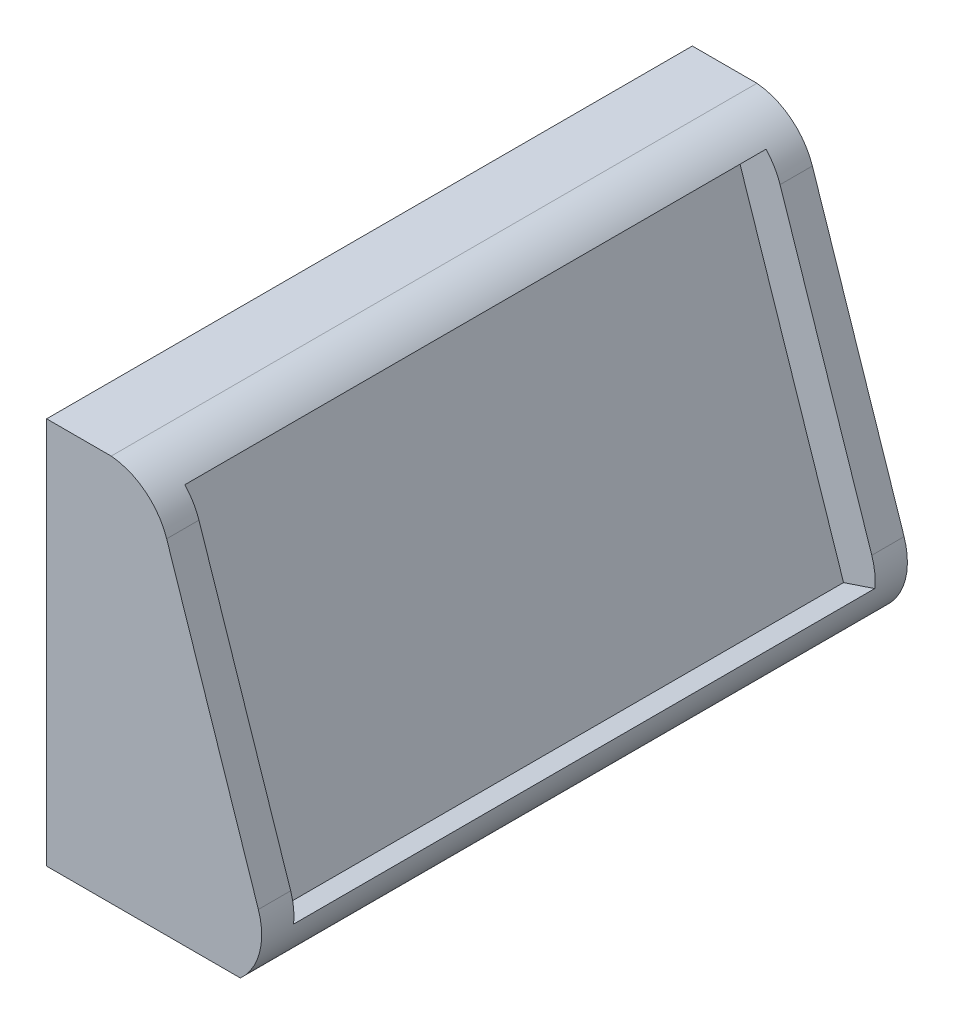
ISO-10303-21;
HEADER;
FILE_DESCRIPTION(('STEP AP214'),'2;1');
FILE_NAME('part.step','',(''),(''),'','','');
FILE_SCHEMA(('AUTOMOTIVE_DESIGN { 1 0 10303 214 1 1 1 1 }'));
ENDSEC;
DATA;
#1=APPLICATION_CONTEXT('core data for automotive mechanical design processes');
#2=APPLICATION_PROTOCOL_DEFINITION('international standard','automotive_design',2000,#1);
#3=PRODUCT_CONTEXT('',#1,'mechanical');
#4=PRODUCT('Part','Part','',(#3));
#5=PRODUCT_RELATED_PRODUCT_CATEGORY('part','',(#4));
#6=PRODUCT_DEFINITION_FORMATION('','',#4);
#7=PRODUCT_DEFINITION_CONTEXT('part definition',#1,'design');
#8=PRODUCT_DEFINITION('design','',#6,#7);
#9=PRODUCT_DEFINITION_SHAPE('','',#8);
#10=(LENGTH_UNIT() NAMED_UNIT(*) SI_UNIT(.MILLI.,.METRE.));
#11=(NAMED_UNIT(*) PLANE_ANGLE_UNIT() SI_UNIT($,.RADIAN.));
#12=(NAMED_UNIT(*) SI_UNIT($,.STERADIAN.) SOLID_ANGLE_UNIT());
#13=UNCERTAINTY_MEASURE_WITH_UNIT(LENGTH_MEASURE(1.E-05),#10,'distance_accuracy_value','');
#14=(GEOMETRIC_REPRESENTATION_CONTEXT(3) GLOBAL_UNCERTAINTY_ASSIGNED_CONTEXT((#13)) GLOBAL_UNIT_ASSIGNED_CONTEXT((#10,
#11,#12)) REPRESENTATION_CONTEXT('',''));
#15=CARTESIAN_POINT('',(0.,0.,0.));
#16=DIRECTION('',(0.,0.,1.));
#17=DIRECTION('',(1.,0.,0.));
#18=AXIS2_PLACEMENT_3D('',#15,#16,#17);
#19=CARTESIAN_POINT('',(23.6920997883031,7.89736659610103,0.));
#20=DIRECTION('',(0.948683298050514,0.316227766016838,0.));
#21=DIRECTION('',(-0.316227766016838,0.948683298050514,0.));
#22=AXIS2_PLACEMENT_3D('',#19,#20,#21);
#23=PLANE('',#22);
#24=DIRECTION('',(0.316227766016838,-0.948683298050514,0.));
#25=VECTOR('',#24,1.);
#26=CARTESIAN_POINT('',(15.6920997883031,31.897366596101,50.));
#27=LINE('',#26,#25);
#28=CARTESIAN_POINT('',(18.590375137541,23.2025405483874,50.));
#29=VERTEX_POINT('',#28);
#30=CARTESIAN_POINT('',(32.7938244390652,-19.4078073561853,50.));
#31=VERTEX_POINT('',#30);
#32=EDGE_CURVE('E158',#29,#31,#27,.T.);
#33=ORIENTED_EDGE('',*,*,#32,.T.);
#34=DIRECTION('',(0.,0.,1.));
#35=VECTOR('',#34,1.);
#36=CARTESIAN_POINT('',(32.7938244390652,-19.4078073561853,-50.));
#37=LINE('',#36,#35);
#38=CARTESIAN_POINT('',(32.7938244390652,-19.4078073561853,45.));
#39=VERTEX_POINT('',#38);
#40=EDGE_CURVE('E207',#31,#39,#37,.F.);
#41=ORIENTED_EDGE('',*,*,#40,.T.);
#42=DIRECTION('',(0.316227766016838,-0.948683298050514,0.));
#43=VECTOR('',#42,1.);
#44=CARTESIAN_POINT('',(17.2732386183873,27.1539501058485,45.));
#45=LINE('',#44,#43);
#46=CARTESIAN_POINT('',(18.590375137541,23.2025405483874,45.));
#47=VERTEX_POINT('',#46);
#48=EDGE_CURVE('E148',#47,#39,#45,.T.);
#49=ORIENTED_EDGE('',*,*,#48,.F.);
#50=DIRECTION('',(0.,0.,1.));
#51=VECTOR('',#50,1.);
#52=CARTESIAN_POINT('',(18.590375137541,23.2025405483874,50.));
#53=LINE('',#52,#51);
#54=EDGE_CURVE('E190',#47,#29,#53,.T.);
#55=ORIENTED_EDGE('',*,*,#54,.T.);
#56=EDGE_LOOP('',(#33,#41,#49,#55));
#57=FACE_BOUND('',#56,.T.);
#58=ADVANCED_FACE('F36',(#57),#23,.T.);
#59=CARTESIAN_POINT('',(10.,-30.,-50.));
#60=DIRECTION('',(0.,0.,1.));
#61=DIRECTION('',(1.,0.,0.));
#62=AXIS2_PLACEMENT_3D('',#59,#60,#61);
#63=PLANE('',#62);
#64=DIRECTION('',(-0.316227766016838,0.948683298050514,0.));
#65=VECTOR('',#64,1.);
#66=CARTESIAN_POINT('',(15.6920997883031,31.897366596101,-50.));
#67=LINE('',#66,#65);
#68=CARTESIAN_POINT('',(32.7938244390652,-19.4078073561853,-50.));
#69=VERTEX_POINT('',#68);
#70=CARTESIAN_POINT('',(18.590375137541,23.2025405483874,-50.));
#71=VERTEX_POINT('',#70);
#72=EDGE_CURVE('E161',#69,#71,#67,.T.);
#73=ORIENTED_EDGE('',*,*,#72,.F.);
#74=CARTESIAN_POINT('',(23.3069914585601,-22.5700850163537,-50.));
#75=DIRECTION('',(0.,0.,1.));
#76=DIRECTION('',(1.,0.,0.));
#77=AXIS2_PLACEMENT_3D('',#74,#75,#76);
#78=CIRCLE('',#77,10.);
#79=CARTESIAN_POINT('',(30.,-30.,-50.));
#80=VERTEX_POINT('',#79);
#81=EDGE_CURVE('E44',#69,#80,#78,.F.);
#82=ORIENTED_EDGE('',*,*,#81,.T.);
#83=DIRECTION('',(-1.,0.,0.));
#84=VECTOR('',#83,1.);
#85=CARTESIAN_POINT('',(10.,-30.,-50.));
#86=LINE('',#85,#84);
#87=CARTESIAN_POINT('',(0.,-30.,-50.));
#88=VERTEX_POINT('',#87);
#89=EDGE_CURVE('E170',#80,#88,#86,.T.);
#90=ORIENTED_EDGE('',*,*,#89,.T.);
#91=DIRECTION('',(0.,1.,0.));
#92=VECTOR('',#91,1.);
#93=CARTESIAN_POINT('',(0.,-30.,-50.));
#94=LINE('',#93,#92);
#95=CARTESIAN_POINT('',(0.,30.,-50.));
#96=VERTEX_POINT('',#95);
#97=EDGE_CURVE('E166',#88,#96,#94,.T.);
#98=ORIENTED_EDGE('',*,*,#97,.T.);
#99=DIRECTION('',(-1.,0.,0.));
#100=VECTOR('',#99,1.);
#101=CARTESIAN_POINT('',(10.,30.,-50.));
#102=LINE('',#101,#100);
#103=CARTESIAN_POINT('',(10.,30.,-50.));
#104=VERTEX_POINT('',#103);
#105=EDGE_CURVE('E187',#104,#96,#102,.T.);
#106=ORIENTED_EDGE('',*,*,#105,.F.);
#107=CARTESIAN_POINT('',(9.10354215703585,20.040262888219,-50.));
#108=DIRECTION('',(0.,0.,1.));
#109=DIRECTION('',(1.,0.,0.));
#110=AXIS2_PLACEMENT_3D('',#107,#108,#109);
#111=CIRCLE('',#110,10.);
#112=EDGE_CURVE('E202',#104,#71,#111,.F.);
#113=ORIENTED_EDGE('',*,*,#112,.T.);
#114=EDGE_LOOP('',(#73,#82,#90,#98,#106,#113));
#115=FACE_BOUND('',#114,.T.);
#116=ADVANCED_FACE('F217',(#115),#63,.F.);
#117=CARTESIAN_POINT('',(10.,30.,50.));
#118=DIRECTION('',(0.,-1.,0.));
#119=DIRECTION('',(0.,0.,-1.));
#120=AXIS2_PLACEMENT_3D('',#117,#118,#119);
#121=PLANE('',#120);
#122=DIRECTION('',(0.,0.,1.));
#123=VECTOR('',#122,1.);
#124=CARTESIAN_POINT('',(0.,30.,50.));
#125=LINE('',#124,#123);
#126=CARTESIAN_POINT('',(0.,30.,50.));
#127=VERTEX_POINT('',#126);
#128=EDGE_CURVE('E174',#96,#127,#125,.T.);
#129=ORIENTED_EDGE('',*,*,#128,.T.);
#130=DIRECTION('',(-1.,0.,0.));
#131=VECTOR('',#130,1.);
#132=CARTESIAN_POINT('',(10.,30.,50.));
#133=LINE('',#132,#131);
#134=CARTESIAN_POINT('',(10.,30.,50.));
#135=VERTEX_POINT('',#134);
#136=EDGE_CURVE('E184',#135,#127,#133,.T.);
#137=ORIENTED_EDGE('',*,*,#136,.F.);
#138=DIRECTION('',(0.,0.,1.));
#139=VECTOR('',#138,1.);
#140=CARTESIAN_POINT('',(10.,30.,50.));
#141=LINE('',#140,#139);
#142=EDGE_CURVE('E167',#104,#135,#141,.T.);
#143=ORIENTED_EDGE('',*,*,#142,.F.);
#144=ORIENTED_EDGE('',*,*,#105,.T.);
#145=EDGE_LOOP('',(#129,#137,#143,#144));
#146=FACE_BOUND('',#145,.T.);
#147=ADVANCED_FACE('F241',(#146),#121,.F.);
#148=CARTESIAN_POINT('',(10.,-30.,50.));
#149=DIRECTION('',(0.,0.,-1.));
#150=DIRECTION('',(-1.,0.,0.));
#151=AXIS2_PLACEMENT_3D('',#148,#149,#150);
#152=PLANE('',#151);
#153=DIRECTION('',(-1.,0.,0.));
#154=VECTOR('',#153,1.);
#155=CARTESIAN_POINT('',(10.,-30.,50.));
#156=LINE('',#155,#154);
#157=CARTESIAN_POINT('',(30.,-30.,50.));
#158=VERTEX_POINT('',#157);
#159=CARTESIAN_POINT('',(0.,-30.,50.));
#160=VERTEX_POINT('',#159);
#161=EDGE_CURVE('E181',#158,#160,#156,.T.);
#162=ORIENTED_EDGE('',*,*,#161,.F.);
#163=CARTESIAN_POINT('',(23.3069914585601,-22.5700850163537,50.));
#164=DIRECTION('',(0.,0.,-1.));
#165=DIRECTION('',(-1.,0.,0.));
#166=AXIS2_PLACEMENT_3D('',#163,#164,#165);
#167=CIRCLE('',#166,10.);
#168=EDGE_CURVE('E11',#158,#31,#167,.F.);
#169=ORIENTED_EDGE('',*,*,#168,.T.);
#170=ORIENTED_EDGE('',*,*,#32,.F.);
#171=CARTESIAN_POINT('',(9.10354215703585,20.040262888219,50.));
#172=DIRECTION('',(0.,0.,-1.));
#173=DIRECTION('',(-1.,0.,0.));
#174=AXIS2_PLACEMENT_3D('',#171,#172,#173);
#175=CIRCLE('',#174,10.);
#176=EDGE_CURVE('E200',#29,#135,#175,.F.);
#177=ORIENTED_EDGE('',*,*,#176,.T.);
#178=ORIENTED_EDGE('',*,*,#136,.T.);
#179=DIRECTION('',(0.,-1.,0.));
#180=VECTOR('',#179,1.);
#181=CARTESIAN_POINT('',(0.,-30.,50.));
#182=LINE('',#181,#180);
#183=EDGE_CURVE('E176',#127,#160,#182,.T.);
#184=ORIENTED_EDGE('',*,*,#183,.T.);
#185=EDGE_LOOP('',(#162,#169,#170,#177,#178,#184));
#186=FACE_BOUND('',#185,.T.);
#187=ADVANCED_FACE('F229',(#186),#152,.F.);
#188=CARTESIAN_POINT('',(10.,-30.,50.));
#189=DIRECTION('',(0.,1.,0.));
#190=DIRECTION('',(0.,0.,1.));
#191=AXIS2_PLACEMENT_3D('',#188,#189,#190);
#192=PLANE('',#191);
#193=DIRECTION('',(0.,0.,-1.));
#194=VECTOR('',#193,1.);
#195=CARTESIAN_POINT('',(0.,-30.,50.));
#196=LINE('',#195,#194);
#197=EDGE_CURVE('E171',#160,#88,#196,.T.);
#198=ORIENTED_EDGE('',*,*,#197,.T.);
#199=ORIENTED_EDGE('',*,*,#89,.F.);
#200=DIRECTION('',(0.,0.,1.));
#201=VECTOR('',#200,1.);
#202=CARTESIAN_POINT('',(30.,-30.,-113.245553203368));
#203=LINE('',#202,#201);
#204=EDGE_CURVE('E163',#80,#158,#203,.T.);
#205=ORIENTED_EDGE('',*,*,#204,.T.);
#206=ORIENTED_EDGE('',*,*,#161,.T.);
#207=EDGE_LOOP('',(#198,#199,#205,#206));
#208=FACE_BOUND('',#207,.T.);
#209=ADVANCED_FACE('F223',(#208),#192,.F.);
#210=CARTESIAN_POINT('',(0.,0.,0.));
#211=DIRECTION('',(-1.,0.,0.));
#212=DIRECTION('',(0.,0.,1.));
#213=AXIS2_PLACEMENT_3D('',#210,#211,#212);
#214=PLANE('',#213);
#215=ORIENTED_EDGE('',*,*,#97,.F.);
#216=ORIENTED_EDGE('',*,*,#197,.F.);
#217=ORIENTED_EDGE('',*,*,#183,.F.);
#218=ORIENTED_EDGE('',*,*,#128,.F.);
#219=EDGE_LOOP('',(#215,#216,#217,#218));
#220=FACE_BOUND('',#219,.T.);
#221=ADVANCED_FACE('F244',(#220),#214,.T.);
#222=DIRECTION('',(-0.316227766016838,0.948683298050514,0.));
#223=VECTOR('',#222,1.);
#224=CARTESIAN_POINT('',(17.2732386183873,27.1539501058485,-45.));
#225=LINE('',#224,#223);
#226=CARTESIAN_POINT('',(32.7938244390652,-19.4078073561853,-45.));
#227=VERTEX_POINT('',#226);
#228=CARTESIAN_POINT('',(18.590375137541,23.2025405483874,-45.));
#229=VERTEX_POINT('',#228);
#230=EDGE_CURVE('E150',#227,#229,#225,.T.);
#231=ORIENTED_EDGE('',*,*,#230,.F.);
#232=DIRECTION('',(0.,0.,1.));
#233=VECTOR('',#232,1.);
#234=CARTESIAN_POINT('',(32.7938244390652,-19.4078073561853,-50.));
#235=LINE('',#234,#233);
#236=EDGE_CURVE('E205',#227,#69,#235,.F.);
#237=ORIENTED_EDGE('',*,*,#236,.T.);
#238=ORIENTED_EDGE('',*,*,#72,.T.);
#239=DIRECTION('',(0.,0.,1.));
#240=VECTOR('',#239,1.);
#241=CARTESIAN_POINT('',(18.590375137541,23.2025405483874,50.));
#242=LINE('',#241,#240);
#243=EDGE_CURVE('E192',#71,#229,#242,.T.);
#244=ORIENTED_EDGE('',*,*,#243,.T.);
#245=EDGE_LOOP('',(#231,#237,#238,#244));
#246=FACE_BOUND('',#245,.T.);
#247=ADVANCED_FACE('F248',(#246),#23,.T.);
#248=CARTESIAN_POINT('',(17.2732386183873,27.1539501058485,45.));
#249=DIRECTION('',(0.,0.,-1.));
#250=DIRECTION('',(0.,1.,0.));
#251=AXIS2_PLACEMENT_3D('',#248,#249,#250);
#252=PLANE('',#251);
#253=ORIENTED_EDGE('',*,*,#48,.T.);
#254=CARTESIAN_POINT('',(23.3069914585601,-22.5700850163537,45.));
#255=DIRECTION('',(0.,0.,-1.));
#256=DIRECTION('',(0.,1.,0.));
#257=AXIS2_PLACEMENT_3D('',#254,#255,#256);
#258=CIRCLE('',#257,10.);
#259=CARTESIAN_POINT('',(33.2488808732584,-23.6465769419666,45.));
#260=VERTEX_POINT('',#259);
#261=EDGE_CURVE('E59',#39,#260,#258,.T.);
#262=ORIENTED_EDGE('',*,*,#261,.T.);
#263=DIRECTION('',(-0.948683298050514,-0.316227766016838,0.));
#264=VECTOR('',#263,1.);
#265=CARTESIAN_POINT('',(34.1109609582189,-23.3592169136464,45.));
#266=LINE('',#265,#264);
#267=CARTESIAN_POINT('',(28.4188611699158,-25.2565835097474,45.));
#268=VERTEX_POINT('',#267);
#269=EDGE_CURVE('E156',#260,#268,#266,.T.);
#270=ORIENTED_EDGE('',*,*,#269,.T.);
#271=DIRECTION('',(0.316227766016838,-0.948683298050514,0.));
#272=VECTOR('',#271,1.);
#273=CARTESIAN_POINT('',(11.5811388300842,25.2565835097474,45.));
#274=LINE('',#273,#272);
#275=CARTESIAN_POINT('',(11.5811388300842,25.2565835097474,45.));
#276=VERTEX_POINT('',#275);
#277=EDGE_CURVE('E251',#276,#268,#274,.T.);
#278=ORIENTED_EDGE('',*,*,#277,.F.);
#279=DIRECTION('',(-0.948683298050514,-0.316227766016838,0.));
#280=VECTOR('',#279,1.);
#281=CARTESIAN_POINT('',(17.2732386183873,27.1539501058485,45.));
#282=LINE('',#281,#280);
#283=CARTESIAN_POINT('',(16.4111585334267,26.8665900775283,45.));
#284=VERTEX_POINT('',#283);
#285=EDGE_CURVE('E134',#284,#276,#282,.T.);
#286=ORIENTED_EDGE('',*,*,#285,.F.);
#287=CARTESIAN_POINT('',(9.10354215703585,20.040262888219,45.));
#288=DIRECTION('',(0.,0.,-1.));
#289=DIRECTION('',(0.,1.,0.));
#290=AXIS2_PLACEMENT_3D('',#287,#288,#289);
#291=CIRCLE('',#290,10.);
#292=EDGE_CURVE('E198',#284,#47,#291,.T.);
#293=ORIENTED_EDGE('',*,*,#292,.T.);
#294=EDGE_LOOP('',(#253,#262,#270,#278,#286,#293));
#295=FACE_BOUND('',#294,.T.);
#296=ADVANCED_FACE('F254',(#295),#252,.T.);
#297=CARTESIAN_POINT('',(34.1109609582189,-23.3592169136464,45.));
#298=DIRECTION('',(-0.316227766016838,0.948683298050514,0.));
#299=DIRECTION('',(-0.948683298050514,-0.316227766016838,0.));
#300=AXIS2_PLACEMENT_3D('',#297,#298,#299);
#301=PLANE('',#300);
#302=ORIENTED_EDGE('',*,*,#269,.F.);
#303=DIRECTION('',(0.,0.,-1.));
#304=VECTOR('',#303,1.);
#305=CARTESIAN_POINT('',(33.2488808732584,-23.6465769419666,45.));
#306=LINE('',#305,#304);
#307=CARTESIAN_POINT('',(33.2488808732584,-23.6465769419666,-45.));
#308=VERTEX_POINT('',#307);
#309=EDGE_CURVE('E51',#260,#308,#306,.T.);
#310=ORIENTED_EDGE('',*,*,#309,.T.);
#311=DIRECTION('',(-0.948683298050514,-0.316227766016838,0.));
#312=VECTOR('',#311,1.);
#313=CARTESIAN_POINT('',(34.1109609582189,-23.3592169136464,-45.));
#314=LINE('',#313,#312);
#315=CARTESIAN_POINT('',(28.4188611699158,-25.2565835097475,-45.));
#316=VERTEX_POINT('',#315);
#317=EDGE_CURVE('E133',#308,#316,#314,.T.);
#318=ORIENTED_EDGE('',*,*,#317,.T.);
#319=DIRECTION('',(0.,0.,-1.));
#320=VECTOR('',#319,1.);
#321=CARTESIAN_POINT('',(28.4188611699158,-25.2565835097474,45.));
#322=LINE('',#321,#320);
#323=EDGE_CURVE('E144',#268,#316,#322,.T.);
#324=ORIENTED_EDGE('',*,*,#323,.F.);
#325=EDGE_LOOP('',(#302,#310,#318,#324));
#326=FACE_BOUND('',#325,.T.);
#327=ADVANCED_FACE('F250',(#326),#301,.T.);
#328=CARTESIAN_POINT('',(17.2732386183873,27.1539501058485,-45.));
#329=DIRECTION('',(0.,0.,1.));
#330=DIRECTION('',(0.,-1.,0.));
#331=AXIS2_PLACEMENT_3D('',#328,#329,#330);
#332=PLANE('',#331);
#333=ORIENTED_EDGE('',*,*,#317,.F.);
#334=CARTESIAN_POINT('',(23.3069914585601,-22.5700850163537,-45.));
#335=DIRECTION('',(0.,0.,1.));
#336=DIRECTION('',(0.,-1.,0.));
#337=AXIS2_PLACEMENT_3D('',#334,#335,#336);
#338=CIRCLE('',#337,10.);
#339=EDGE_CURVE('E212',#308,#227,#338,.T.);
#340=ORIENTED_EDGE('',*,*,#339,.T.);
#341=ORIENTED_EDGE('',*,*,#230,.T.);
#342=CARTESIAN_POINT('',(9.10354215703585,20.040262888219,-45.));
#343=DIRECTION('',(0.,0.,1.));
#344=DIRECTION('',(0.,-1.,0.));
#345=AXIS2_PLACEMENT_3D('',#342,#343,#344);
#346=CIRCLE('',#345,10.);
#347=CARTESIAN_POINT('',(16.4111585334267,26.8665900775283,-45.));
#348=VERTEX_POINT('',#347);
#349=EDGE_CURVE('E129',#229,#348,#346,.T.);
#350=ORIENTED_EDGE('',*,*,#349,.T.);
#351=DIRECTION('',(-0.948683298050514,-0.316227766016838,0.));
#352=VECTOR('',#351,1.);
#353=CARTESIAN_POINT('',(17.2732386183873,27.1539501058485,-45.));
#354=LINE('',#353,#352);
#355=CARTESIAN_POINT('',(11.5811388300842,25.2565835097474,-45.));
#356=VERTEX_POINT('',#355);
#357=EDGE_CURVE('E124',#348,#356,#354,.T.);
#358=ORIENTED_EDGE('',*,*,#357,.T.);
#359=DIRECTION('',(-0.316227766016838,0.948683298050514,0.));
#360=VECTOR('',#359,1.);
#361=CARTESIAN_POINT('',(11.5811388300842,25.2565835097474,-45.));
#362=LINE('',#361,#360);
#363=EDGE_CURVE('E127',#316,#356,#362,.T.);
#364=ORIENTED_EDGE('',*,*,#363,.F.);
#365=EDGE_LOOP('',(#333,#340,#341,#350,#358,#364));
#366=FACE_BOUND('',#365,.T.);
#367=ADVANCED_FACE('F126',(#366),#332,.T.);
#368=CARTESIAN_POINT('',(17.2732386183873,27.1539501058485,45.));
#369=DIRECTION('',(0.316227766016838,-0.948683298050514,0.));
#370=DIRECTION('',(0.948683298050514,0.316227766016838,0.));
#371=AXIS2_PLACEMENT_3D('',#368,#369,#370);
#372=PLANE('',#371);
#373=ORIENTED_EDGE('',*,*,#357,.F.);
#374=DIRECTION('',(0.,0.,-1.));
#375=VECTOR('',#374,1.);
#376=CARTESIAN_POINT('',(16.4111585334267,26.8665900775283,-45.));
#377=LINE('',#376,#375);
#378=EDGE_CURVE('E196',#348,#284,#377,.F.);
#379=ORIENTED_EDGE('',*,*,#378,.T.);
#380=ORIENTED_EDGE('',*,*,#285,.T.);
#381=DIRECTION('',(0.,0.,1.));
#382=VECTOR('',#381,1.);
#383=CARTESIAN_POINT('',(11.5811388300842,25.2565835097474,45.));
#384=LINE('',#383,#382);
#385=EDGE_CURVE('E141',#356,#276,#384,.T.);
#386=ORIENTED_EDGE('',*,*,#385,.F.);
#387=EDGE_LOOP('',(#373,#379,#380,#386));
#388=FACE_BOUND('',#387,.T.);
#389=ADVANCED_FACE('F146',(#388),#372,.T.);
#390=CARTESIAN_POINT('',(10.,30.,-113.245553203368));
#391=DIRECTION('',(0.948683298050514,0.316227766016838,0.));
#392=DIRECTION('',(-0.316227766016838,0.948683298050514,0.));
#393=AXIS2_PLACEMENT_3D('',#390,#391,#392);
#394=PLANE('',#393);
#395=ORIENTED_EDGE('',*,*,#277,.T.);
#396=ORIENTED_EDGE('',*,*,#323,.T.);
#397=ORIENTED_EDGE('',*,*,#363,.T.);
#398=ORIENTED_EDGE('',*,*,#385,.T.);
#399=EDGE_LOOP('',(#395,#396,#397,#398));
#400=FACE_BOUND('',#399,.T.);
#401=ADVANCED_FACE('F140',(#400),#394,.T.);
#402=CARTESIAN_POINT('',(9.10354215703585,20.040262888219,50.));
#403=DIRECTION('',(0.,0.,-1.));
#404=DIRECTION('',(-1.,0.,0.));
#405=AXIS2_PLACEMENT_3D('',#402,#403,#404);
#406=CYLINDRICAL_SURFACE('',#405,10.);
#407=ORIENTED_EDGE('',*,*,#112,.F.);
#408=ORIENTED_EDGE('',*,*,#142,.T.);
#409=ORIENTED_EDGE('',*,*,#176,.F.);
#410=ORIENTED_EDGE('',*,*,#54,.F.);
#411=ORIENTED_EDGE('',*,*,#292,.F.);
#412=ORIENTED_EDGE('',*,*,#378,.F.);
#413=ORIENTED_EDGE('',*,*,#349,.F.);
#414=ORIENTED_EDGE('',*,*,#243,.F.);
#415=EDGE_LOOP('',(#407,#408,#409,#410,#411,#412,#413,#414));
#416=FACE_BOUND('',#415,.T.);
#417=ADVANCED_FACE('F237',(#416),#406,.T.);
#418=CARTESIAN_POINT('',(23.3069914585601,-22.5700850163537,50.));
#419=DIRECTION('',(0.,0.,-1.));
#420=DIRECTION('',(-1.,0.,0.));
#421=AXIS2_PLACEMENT_3D('',#418,#419,#420);
#422=CYLINDRICAL_SURFACE('',#421,10.);
#423=ORIENTED_EDGE('',*,*,#168,.F.);
#424=ORIENTED_EDGE('',*,*,#204,.F.);
#425=ORIENTED_EDGE('',*,*,#81,.F.);
#426=ORIENTED_EDGE('',*,*,#236,.F.);
#427=ORIENTED_EDGE('',*,*,#339,.F.);
#428=ORIENTED_EDGE('',*,*,#309,.F.);
#429=ORIENTED_EDGE('',*,*,#261,.F.);
#430=ORIENTED_EDGE('',*,*,#40,.F.);
#431=EDGE_LOOP('',(#423,#424,#425,#426,#427,#428,#429,#430));
#432=FACE_BOUND('',#431,.T.);
#433=ADVANCED_FACE('F38',(#432),#422,.T.);
#434=CLOSED_SHELL('',(#58,#116,#147,#187,#209,#221,#247,#296,#327,#367,#389,#401,#417,#433));
#435=MANIFOLD_SOLID_BREP('B2',#434);
#436=ADVANCED_BREP_SHAPE_REPRESENTATION('',(#18,#435),#14);
#437=SHAPE_DEFINITION_REPRESENTATION(#9,#436);
ENDSEC;
END-ISO-10303-21;
